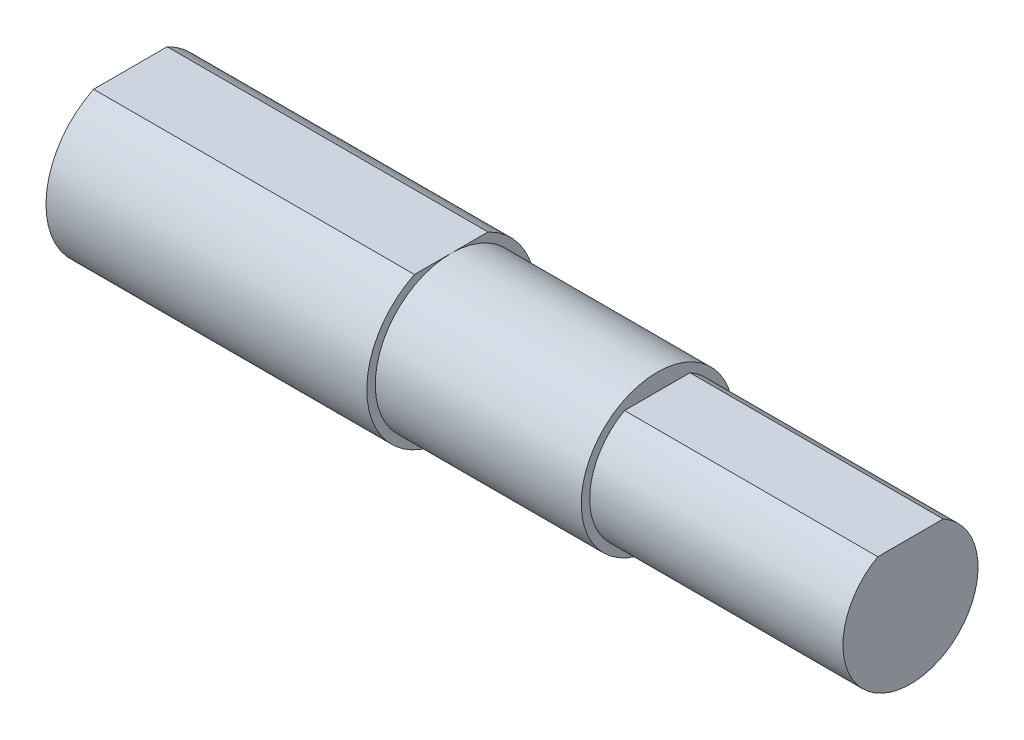
ISO-10303-21;
HEADER;
FILE_DESCRIPTION(('STEP AP214'),'2;1');
FILE_NAME('part.step','',(''),(''),'','','');
FILE_SCHEMA(('AUTOMOTIVE_DESIGN { 1 0 10303 214 1 1 1 1 }'));
ENDSEC;
DATA;
#1=APPLICATION_CONTEXT('core data for automotive mechanical design processes');
#2=APPLICATION_PROTOCOL_DEFINITION('international standard','automotive_design',2000,#1);
#3=PRODUCT_CONTEXT('',#1,'mechanical');
#4=PRODUCT('Part','Part','',(#3));
#5=PRODUCT_RELATED_PRODUCT_CATEGORY('part','',(#4));
#6=PRODUCT_DEFINITION_FORMATION('','',#4);
#7=PRODUCT_DEFINITION_CONTEXT('part definition',#1,'design');
#8=PRODUCT_DEFINITION('design','',#6,#7);
#9=PRODUCT_DEFINITION_SHAPE('','',#8);
#10=(LENGTH_UNIT() NAMED_UNIT(*) SI_UNIT(.MILLI.,.METRE.));
#11=(NAMED_UNIT(*) PLANE_ANGLE_UNIT() SI_UNIT($,.RADIAN.));
#12=(NAMED_UNIT(*) SI_UNIT($,.STERADIAN.) SOLID_ANGLE_UNIT());
#13=UNCERTAINTY_MEASURE_WITH_UNIT(LENGTH_MEASURE(1.E-05),#10,'distance_accuracy_value','');
#14=(GEOMETRIC_REPRESENTATION_CONTEXT(3) GLOBAL_UNCERTAINTY_ASSIGNED_CONTEXT((#13)) GLOBAL_UNIT_ASSIGNED_CONTEXT((#10,
#11,#12)) REPRESENTATION_CONTEXT('',''));
#15=CARTESIAN_POINT('',(0.,0.,0.));
#16=DIRECTION('',(0.,0.,1.));
#17=DIRECTION('',(1.,0.,0.));
#18=AXIS2_PLACEMENT_3D('',#15,#16,#17);
#19=CARTESIAN_POINT('',(31.2,0.,0.));
#20=DIRECTION('',(1.,0.,0.));
#21=DIRECTION('',(0.,0.,-1.));
#22=AXIS2_PLACEMENT_3D('',#19,#20,#21);
#23=PLANE('',#22);
#24=CARTESIAN_POINT('',(31.2,0.,0.));
#25=DIRECTION('',(1.,0.,0.));
#26=DIRECTION('',(0.,0.,-1.));
#27=AXIS2_PLACEMENT_3D('',#24,#25,#26);
#28=CIRCLE('',#27,4.5);
#29=CARTESIAN_POINT('',(31.2,0.,-4.5));
#30=VERTEX_POINT('',#29);
#31=EDGE_CURVE('E84',#30,#30,#28,.T.);
#32=ORIENTED_EDGE('',*,*,#31,.T.);
#33=EDGE_LOOP('',(#32));
#34=FACE_BOUND('',#33,.T.);
#35=DIRECTION('',(0.,0.,1.));
#36=VECTOR('',#35,1.);
#37=CARTESIAN_POINT('',(31.2,3.5,1.93649167310371));
#38=LINE('',#37,#36);
#39=CARTESIAN_POINT('',(31.2,3.5,-1.93649167310371));
#40=VERTEX_POINT('',#39);
#41=CARTESIAN_POINT('',(31.2,3.5,1.93649167310371));
#42=VERTEX_POINT('',#41);
#43=EDGE_CURVE('E100',#40,#42,#38,.T.);
#44=ORIENTED_EDGE('',*,*,#43,.F.);
#45=CARTESIAN_POINT('',(31.2,0.,0.));
#46=DIRECTION('',(1.,0.,0.));
#47=DIRECTION('',(0.,0.,-1.));
#48=AXIS2_PLACEMENT_3D('',#45,#46,#47);
#49=CIRCLE('',#48,4.);
#50=EDGE_CURVE('E49',#42,#40,#49,.T.);
#51=ORIENTED_EDGE('',*,*,#50,.F.);
#52=EDGE_LOOP('',(#44,#51));
#53=FACE_BOUND('',#52,.T.);
#54=ADVANCED_FACE('F34',(#34,#53),#23,.T.);
#55=CARTESIAN_POINT('',(19.,0.,0.));
#56=DIRECTION('',(-1.,0.,0.));
#57=DIRECTION('',(0.,0.,1.));
#58=AXIS2_PLACEMENT_3D('',#55,#56,#57);
#59=CYLINDRICAL_SURFACE('',#58,5.);
#60=CARTESIAN_POINT('',(0.,0.,0.));
#61=DIRECTION('',(1.,0.,0.));
#62=DIRECTION('',(0.,0.,-1.));
#63=AXIS2_PLACEMENT_3D('',#60,#61,#62);
#64=CIRCLE('',#63,5.);
#65=CARTESIAN_POINT('',(0.,4.5,2.17944947177034));
#66=VERTEX_POINT('',#65);
#67=CARTESIAN_POINT('',(0.,4.5,-2.17944947177034));
#68=VERTEX_POINT('',#67);
#69=EDGE_CURVE('E79',#66,#68,#64,.T.);
#70=ORIENTED_EDGE('',*,*,#69,.T.);
#71=DIRECTION('',(-1.,0.,0.));
#72=VECTOR('',#71,1.);
#73=CARTESIAN_POINT('',(19.,4.5,-2.17944947177034));
#74=LINE('',#73,#72);
#75=CARTESIAN_POINT('',(19.,4.5,-2.17944947177034));
#76=VERTEX_POINT('',#75);
#77=EDGE_CURVE('E11',#76,#68,#74,.T.);
#78=ORIENTED_EDGE('',*,*,#77,.F.);
#79=CARTESIAN_POINT('',(19.,0.,0.));
#80=DIRECTION('',(1.,0.,0.));
#81=DIRECTION('',(0.,0.,-1.));
#82=AXIS2_PLACEMENT_3D('',#79,#80,#81);
#83=CIRCLE('',#82,5.);
#84=CARTESIAN_POINT('',(19.,4.5,2.17944947177034));
#85=VERTEX_POINT('',#84);
#86=EDGE_CURVE('E78',#85,#76,#83,.T.);
#87=ORIENTED_EDGE('',*,*,#86,.F.);
#88=DIRECTION('',(-1.,0.,0.));
#89=VECTOR('',#88,1.);
#90=CARTESIAN_POINT('',(19.,4.5,2.17944947177034));
#91=LINE('',#90,#89);
#92=EDGE_CURVE('E42',#85,#66,#91,.T.);
#93=ORIENTED_EDGE('',*,*,#92,.T.);
#94=EDGE_LOOP('',(#70,#78,#87,#93));
#95=FACE_BOUND('',#94,.T.);
#96=ADVANCED_FACE('F36',(#95),#59,.T.);
#97=CARTESIAN_POINT('',(19.,4.5,2.17944947177034));
#98=DIRECTION('',(0.,-1.,0.));
#99=DIRECTION('',(0.,0.,-1.));
#100=AXIS2_PLACEMENT_3D('',#97,#98,#99);
#101=PLANE('',#100);
#102=DIRECTION('',(0.,0.,1.));
#103=VECTOR('',#102,1.);
#104=CARTESIAN_POINT('',(0.,4.5,2.17944947177034));
#105=LINE('',#104,#103);
#106=EDGE_CURVE('E70',#68,#66,#105,.T.);
#107=ORIENTED_EDGE('',*,*,#106,.T.);
#108=ORIENTED_EDGE('',*,*,#92,.F.);
#109=DIRECTION('',(0.,0.,1.));
#110=VECTOR('',#109,1.);
#111=CARTESIAN_POINT('',(19.,4.5,2.17944947177034));
#112=LINE('',#111,#110);
#113=CARTESIAN_POINT('',(19.,4.5,0.));
#114=VERTEX_POINT('',#113);
#115=EDGE_CURVE('E58',#114,#85,#112,.T.);
#116=ORIENTED_EDGE('',*,*,#115,.F.);
#117=EDGE_CURVE('E82',#76,#114,#112,.T.);
#118=ORIENTED_EDGE('',*,*,#117,.F.);
#119=ORIENTED_EDGE('',*,*,#77,.T.);
#120=EDGE_LOOP('',(#107,#108,#116,#118,#119));
#121=FACE_BOUND('',#120,.T.);
#122=ADVANCED_FACE('F72',(#121),#101,.F.);
#123=CARTESIAN_POINT('',(19.,0.,0.));
#124=DIRECTION('',(1.,0.,0.));
#125=DIRECTION('',(0.,0.,-1.));
#126=AXIS2_PLACEMENT_3D('',#123,#124,#125);
#127=PLANE('',#126);
#128=ORIENTED_EDGE('',*,*,#117,.T.);
#129=CARTESIAN_POINT('',(19.,0.,0.));
#130=DIRECTION('',(1.,0.,0.));
#131=DIRECTION('',(0.,0.,-1.));
#132=AXIS2_PLACEMENT_3D('',#129,#130,#131);
#133=CIRCLE('',#132,4.5);
#134=EDGE_CURVE('E87',#114,#114,#133,.T.);
#135=ORIENTED_EDGE('',*,*,#134,.F.);
#136=ORIENTED_EDGE('',*,*,#115,.T.);
#137=ORIENTED_EDGE('',*,*,#86,.T.);
#138=EDGE_LOOP('',(#128,#135,#136,#137));
#139=FACE_BOUND('',#138,.T.);
#140=ADVANCED_FACE('F124',(#139),#127,.T.);
#141=CARTESIAN_POINT('',(0.,0.,0.));
#142=DIRECTION('',(1.,0.,0.));
#143=DIRECTION('',(0.,0.,-1.));
#144=AXIS2_PLACEMENT_3D('',#141,#142,#143);
#145=PLANE('',#144);
#146=ORIENTED_EDGE('',*,*,#69,.F.);
#147=ORIENTED_EDGE('',*,*,#106,.F.);
#148=EDGE_LOOP('',(#146,#147));
#149=FACE_BOUND('',#148,.T.);
#150=ADVANCED_FACE('F83',(#149),#145,.F.);
#151=CARTESIAN_POINT('',(31.2,0.,0.));
#152=DIRECTION('',(-1.,0.,0.));
#153=DIRECTION('',(0.,0.,1.));
#154=AXIS2_PLACEMENT_3D('',#151,#152,#153);
#155=CYLINDRICAL_SURFACE('',#154,4.5);
#156=ORIENTED_EDGE('',*,*,#31,.F.);
#157=EDGE_LOOP('',(#156));
#158=FACE_BOUND('',#157,.T.);
#159=ORIENTED_EDGE('',*,*,#134,.T.);
#160=EDGE_LOOP('',(#159));
#161=FACE_BOUND('',#160,.T.);
#162=ADVANCED_FACE('F126',(#158,#161),#155,.T.);
#163=CARTESIAN_POINT('',(46.2,0.,0.));
#164=DIRECTION('',(-1.,0.,0.));
#165=DIRECTION('',(0.,0.,1.));
#166=AXIS2_PLACEMENT_3D('',#163,#164,#165);
#167=CYLINDRICAL_SURFACE('',#166,4.);
#168=ORIENTED_EDGE('',*,*,#50,.T.);
#169=DIRECTION('',(-1.,0.,0.));
#170=VECTOR('',#169,1.);
#171=CARTESIAN_POINT('',(46.2,3.5,-1.93649167310371));
#172=LINE('',#171,#170);
#173=CARTESIAN_POINT('',(46.2,3.5,-1.93649167310371));
#174=VERTEX_POINT('',#173);
#175=EDGE_CURVE('E94',#174,#40,#172,.T.);
#176=ORIENTED_EDGE('',*,*,#175,.F.);
#177=CARTESIAN_POINT('',(46.2,0.,0.));
#178=DIRECTION('',(1.,0.,0.));
#179=DIRECTION('',(0.,0.,-1.));
#180=AXIS2_PLACEMENT_3D('',#177,#178,#179);
#181=CIRCLE('',#180,4.);
#182=CARTESIAN_POINT('',(46.2,3.5,1.93649167310371));
#183=VERTEX_POINT('',#182);
#184=EDGE_CURVE('E103',#183,#174,#181,.T.);
#185=ORIENTED_EDGE('',*,*,#184,.F.);
#186=DIRECTION('',(-1.,0.,0.));
#187=VECTOR('',#186,1.);
#188=CARTESIAN_POINT('',(46.2,3.5,1.93649167310371));
#189=LINE('',#188,#187);
#190=EDGE_CURVE('E97',#183,#42,#189,.T.);
#191=ORIENTED_EDGE('',*,*,#190,.T.);
#192=EDGE_LOOP('',(#168,#176,#185,#191));
#193=FACE_BOUND('',#192,.T.);
#194=ADVANCED_FACE('F117',(#193),#167,.T.);
#195=CARTESIAN_POINT('',(46.2,3.5,1.93649167310371));
#196=DIRECTION('',(0.,-1.,0.));
#197=DIRECTION('',(0.,0.,-1.));
#198=AXIS2_PLACEMENT_3D('',#195,#196,#197);
#199=PLANE('',#198);
#200=ORIENTED_EDGE('',*,*,#43,.T.);
#201=ORIENTED_EDGE('',*,*,#190,.F.);
#202=DIRECTION('',(0.,0.,1.));
#203=VECTOR('',#202,1.);
#204=CARTESIAN_POINT('',(46.2,3.5,1.93649167310371));
#205=LINE('',#204,#203);
#206=EDGE_CURVE('E99',#174,#183,#205,.T.);
#207=ORIENTED_EDGE('',*,*,#206,.F.);
#208=ORIENTED_EDGE('',*,*,#175,.T.);
#209=EDGE_LOOP('',(#200,#201,#207,#208));
#210=FACE_BOUND('',#209,.T.);
#211=ADVANCED_FACE('F120',(#210),#199,.F.);
#212=CARTESIAN_POINT('',(46.2,0.,0.));
#213=DIRECTION('',(1.,0.,0.));
#214=DIRECTION('',(0.,0.,-1.));
#215=AXIS2_PLACEMENT_3D('',#212,#213,#214);
#216=PLANE('',#215);
#217=ORIENTED_EDGE('',*,*,#184,.T.);
#218=ORIENTED_EDGE('',*,*,#206,.T.);
#219=EDGE_LOOP('',(#217,#218));
#220=FACE_BOUND('',#219,.T.);
#221=ADVANCED_FACE('F111',(#220),#216,.T.);
#222=CLOSED_SHELL('',(#54,#96,#122,#140,#150,#162,#194,#211,#221));
#223=MANIFOLD_SOLID_BREP('B2',#222);
#224=ADVANCED_BREP_SHAPE_REPRESENTATION('',(#18,#223),#14);
#225=SHAPE_DEFINITION_REPRESENTATION(#9,#224);
ENDSEC;
END-ISO-10303-21;
